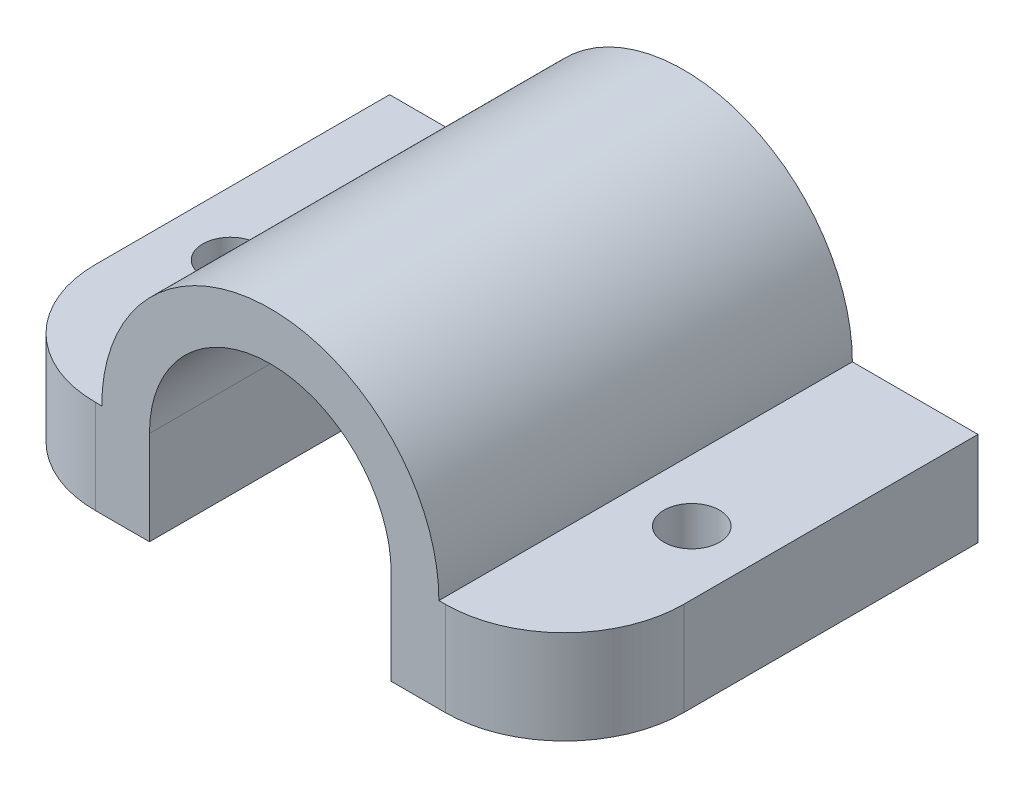
ISO-10303-21;
HEADER;
FILE_DESCRIPTION(('STEP AP214'),'2;1');
FILE_NAME('part.step','',(''),(''),'','','');
FILE_SCHEMA(('AUTOMOTIVE_DESIGN { 1 0 10303 214 1 1 1 1 }'));
ENDSEC;
DATA;
#1=APPLICATION_CONTEXT('core data for automotive mechanical design processes');
#2=APPLICATION_PROTOCOL_DEFINITION('international standard','automotive_design',2000,#1);
#3=PRODUCT_CONTEXT('',#1,'mechanical');
#4=PRODUCT('Part','Part','',(#3));
#5=PRODUCT_RELATED_PRODUCT_CATEGORY('part','',(#4));
#6=PRODUCT_DEFINITION_FORMATION('','',#4);
#7=PRODUCT_DEFINITION_CONTEXT('part definition',#1,'design');
#8=PRODUCT_DEFINITION('design','',#6,#7);
#9=PRODUCT_DEFINITION_SHAPE('','',#8);
#10=(LENGTH_UNIT() NAMED_UNIT(*) SI_UNIT(.MILLI.,.METRE.));
#11=(NAMED_UNIT(*) PLANE_ANGLE_UNIT() SI_UNIT($,.RADIAN.));
#12=(NAMED_UNIT(*) SI_UNIT($,.STERADIAN.) SOLID_ANGLE_UNIT());
#13=UNCERTAINTY_MEASURE_WITH_UNIT(LENGTH_MEASURE(1.E-05),#10,'distance_accuracy_value','');
#14=(GEOMETRIC_REPRESENTATION_CONTEXT(3) GLOBAL_UNCERTAINTY_ASSIGNED_CONTEXT((#13)) GLOBAL_UNIT_ASSIGNED_CONTEXT((#10,
#11,#12)) REPRESENTATION_CONTEXT('',''));
#15=CARTESIAN_POINT('',(0.,0.,0.));
#16=DIRECTION('',(0.,0.,1.));
#17=DIRECTION('',(1.,0.,0.));
#18=AXIS2_PLACEMENT_3D('',#15,#16,#17);
#19=CARTESIAN_POINT('',(0.,0.,12.));
#20=DIRECTION('',(0.,0.,-1.));
#21=DIRECTION('',(-1.,0.,0.));
#22=AXIS2_PLACEMENT_3D('',#19,#20,#21);
#23=CYLINDRICAL_SURFACE('',#22,10.6);
#24=DIRECTION('',(0.,0.,-1.));
#25=VECTOR('',#24,1.);
#26=CARTESIAN_POINT('',(10.6,0.,12.));
#27=LINE('',#26,#25);
#28=CARTESIAN_POINT('',(10.6,0.,12.));
#29=VERTEX_POINT('',#28);
#30=CARTESIAN_POINT('',(10.6,0.,-14.));
#31=VERTEX_POINT('',#30);
#32=EDGE_CURVE('E163',#29,#31,#27,.T.);
#33=ORIENTED_EDGE('',*,*,#32,.T.);
#34=CARTESIAN_POINT('',(0.,0.,-14.));
#35=DIRECTION('',(0.,0.,-1.));
#36=DIRECTION('',(-1.,0.,0.));
#37=AXIS2_PLACEMENT_3D('',#34,#35,#36);
#38=CIRCLE('',#37,10.6);
#39=CARTESIAN_POINT('',(-10.6,0.,-14.));
#40=VERTEX_POINT('',#39);
#41=EDGE_CURVE('E162',#40,#31,#38,.T.);
#42=ORIENTED_EDGE('',*,*,#41,.F.);
#43=DIRECTION('',(0.,0.,-1.));
#44=VECTOR('',#43,1.);
#45=CARTESIAN_POINT('',(-10.6,0.,12.));
#46=LINE('',#45,#44);
#47=CARTESIAN_POINT('',(-10.6,0.,12.));
#48=VERTEX_POINT('',#47);
#49=EDGE_CURVE('E147',#48,#40,#46,.T.);
#50=ORIENTED_EDGE('',*,*,#49,.F.);
#51=CARTESIAN_POINT('',(0.,0.,12.));
#52=DIRECTION('',(0.,0.,1.));
#53=DIRECTION('',(1.,0.,0.));
#54=AXIS2_PLACEMENT_3D('',#51,#52,#53);
#55=CIRCLE('',#54,10.6);
#56=EDGE_CURVE('E221',#48,#29,#55,.F.);
#57=ORIENTED_EDGE('',*,*,#56,.T.);
#58=EDGE_LOOP('',(#33,#42,#50,#57));
#59=FACE_BOUND('',#58,.T.);
#60=ADVANCED_FACE('F35',(#59),#23,.T.);
#61=CARTESIAN_POINT('',(0.,0.,12.));
#62=DIRECTION('',(0.,1.,0.));
#63=DIRECTION('',(0.,0.,1.));
#64=AXIS2_PLACEMENT_3D('',#61,#62,#63);
#65=PLANE('',#64);
#66=CARTESIAN_POINT('',(-14.5,0.,0.));
#67=DIRECTION('',(0.,1.,0.));
#68=DIRECTION('',(0.,0.,1.));
#69=AXIS2_PLACEMENT_3D('',#66,#67,#68);
#70=CIRCLE('',#69,1.75);
#71=CARTESIAN_POINT('',(-14.5,0.,1.75));
#72=VERTEX_POINT('',#71);
#73=EDGE_CURVE('E204',#72,#72,#70,.T.);
#74=ORIENTED_EDGE('',*,*,#73,.F.);
#75=EDGE_LOOP('',(#74));
#76=FACE_BOUND('',#75,.T.);
#77=DIRECTION('',(0.,0.,-1.));
#78=VECTOR('',#77,1.);
#79=CARTESIAN_POINT('',(-18.5,0.,12.));
#80=LINE('',#79,#78);
#81=CARTESIAN_POINT('',(-18.5,0.,4.5));
#82=VERTEX_POINT('',#81);
#83=CARTESIAN_POINT('',(-18.5,0.,-14.));
#84=VERTEX_POINT('',#83);
#85=EDGE_CURVE('E159',#82,#84,#80,.T.);
#86=ORIENTED_EDGE('',*,*,#85,.F.);
#87=CARTESIAN_POINT('',(-11.,0.,4.5));
#88=DIRECTION('',(0.,1.,0.));
#89=DIRECTION('',(0.,0.,1.));
#90=AXIS2_PLACEMENT_3D('',#87,#88,#89);
#91=CIRCLE('',#90,7.5);
#92=CARTESIAN_POINT('',(-11.,0.,12.));
#93=VERTEX_POINT('',#92);
#94=EDGE_CURVE('E43',#82,#93,#91,.T.);
#95=ORIENTED_EDGE('',*,*,#94,.T.);
#96=DIRECTION('',(1.,0.,0.));
#97=VECTOR('',#96,1.);
#98=CARTESIAN_POINT('',(0.,0.,12.));
#99=LINE('',#98,#97);
#100=EDGE_CURVE('E154',#93,#48,#99,.T.);
#101=ORIENTED_EDGE('',*,*,#100,.T.);
#102=ORIENTED_EDGE('',*,*,#49,.T.);
#103=DIRECTION('',(1.,0.,0.));
#104=VECTOR('',#103,1.);
#105=CARTESIAN_POINT('',(0.,0.,-14.));
#106=LINE('',#105,#104);
#107=EDGE_CURVE('E152',#84,#40,#106,.T.);
#108=ORIENTED_EDGE('',*,*,#107,.F.);
#109=EDGE_LOOP('',(#86,#95,#101,#102,#108));
#110=FACE_BOUND('',#109,.T.);
#111=ADVANCED_FACE('F150',(#76,#110),#65,.T.);
#112=CARTESIAN_POINT('',(-18.5,0.,12.));
#113=DIRECTION('',(-1.,0.,0.));
#114=DIRECTION('',(0.,0.,1.));
#115=AXIS2_PLACEMENT_3D('',#112,#113,#114);
#116=PLANE('',#115);
#117=DIRECTION('',(0.,0.,-1.));
#118=VECTOR('',#117,1.);
#119=CARTESIAN_POINT('',(-18.5,-5.9,12.));
#120=LINE('',#119,#118);
#121=CARTESIAN_POINT('',(-18.5,-5.9,4.5));
#122=VERTEX_POINT('',#121);
#123=CARTESIAN_POINT('',(-18.5,-5.9,-14.));
#124=VERTEX_POINT('',#123);
#125=EDGE_CURVE('E261',#122,#124,#120,.T.);
#126=ORIENTED_EDGE('',*,*,#125,.F.);
#127=DIRECTION('',(0.,1.,0.));
#128=VECTOR('',#127,1.);
#129=CARTESIAN_POINT('',(-18.5,0.,4.5));
#130=LINE('',#129,#128);
#131=EDGE_CURVE('E274',#122,#82,#130,.T.);
#132=ORIENTED_EDGE('',*,*,#131,.T.);
#133=ORIENTED_EDGE('',*,*,#85,.T.);
#134=DIRECTION('',(0.,1.,0.));
#135=VECTOR('',#134,1.);
#136=CARTESIAN_POINT('',(-18.5,0.,-14.));
#137=LINE('',#136,#135);
#138=EDGE_CURVE('E173',#124,#84,#137,.T.);
#139=ORIENTED_EDGE('',*,*,#138,.F.);
#140=EDGE_LOOP('',(#126,#132,#133,#139));
#141=FACE_BOUND('',#140,.T.);
#142=ADVANCED_FACE('F280',(#141),#116,.T.);
#143=CARTESIAN_POINT('',(0.,-5.9,12.));
#144=DIRECTION('',(0.,-1.,0.));
#145=DIRECTION('',(1.,0.,0.));
#146=AXIS2_PLACEMENT_3D('',#143,#144,#145);
#147=PLANE('',#146);
#148=CARTESIAN_POINT('',(-14.5,-5.9,0.));
#149=DIRECTION('',(0.,-1.,0.));
#150=DIRECTION('',(1.,0.,0.));
#151=AXIS2_PLACEMENT_3D('',#148,#149,#150);
#152=CIRCLE('',#151,1.75);
#153=CARTESIAN_POINT('',(-12.75,-5.9,0.));
#154=VERTEX_POINT('',#153);
#155=EDGE_CURVE('E556',#154,#154,#152,.F.);
#156=ORIENTED_EDGE('',*,*,#155,.T.);
#157=EDGE_LOOP('',(#156));
#158=FACE_BOUND('',#157,.T.);
#159=DIRECTION('',(-1.,0.,0.));
#160=VECTOR('',#159,1.);
#161=CARTESIAN_POINT('',(0.,-5.9,12.));
#162=LINE('',#161,#160);
#163=CARTESIAN_POINT('',(-7.6,-5.9,12.));
#164=VERTEX_POINT('',#163);
#165=CARTESIAN_POINT('',(-11.,-5.9,12.));
#166=VERTEX_POINT('',#165);
#167=EDGE_CURVE('E225',#164,#166,#162,.T.);
#168=ORIENTED_EDGE('',*,*,#167,.T.);
#169=CARTESIAN_POINT('',(-11.,-5.9,4.5));
#170=DIRECTION('',(0.,-1.,0.));
#171=DIRECTION('',(1.,0.,0.));
#172=AXIS2_PLACEMENT_3D('',#169,#170,#171);
#173=CIRCLE('',#172,7.5);
#174=EDGE_CURVE('E11',#166,#122,#173,.T.);
#175=ORIENTED_EDGE('',*,*,#174,.T.);
#176=ORIENTED_EDGE('',*,*,#125,.T.);
#177=DIRECTION('',(-1.,0.,0.));
#178=VECTOR('',#177,1.);
#179=CARTESIAN_POINT('',(0.,-5.9,-14.));
#180=LINE('',#179,#178);
#181=CARTESIAN_POINT('',(-4.6,-5.9,-14.));
#182=VERTEX_POINT('',#181);
#183=EDGE_CURVE('E197',#182,#124,#180,.T.);
#184=ORIENTED_EDGE('',*,*,#183,.F.);
#185=DIRECTION('',(0.,0.,1.));
#186=VECTOR('',#185,1.);
#187=CARTESIAN_POINT('',(-4.6,-5.9,-14.));
#188=LINE('',#187,#186);
#189=CARTESIAN_POINT('',(-4.6,-5.9,-12.));
#190=VERTEX_POINT('',#189);
#191=EDGE_CURVE('E200',#182,#190,#188,.T.);
#192=ORIENTED_EDGE('',*,*,#191,.T.);
#193=DIRECTION('',(-1.,0.,0.));
#194=VECTOR('',#193,1.);
#195=CARTESIAN_POINT('',(0.,-5.9,-12.));
#196=LINE('',#195,#194);
#197=CARTESIAN_POINT('',(-7.6,-5.9,-12.));
#198=VERTEX_POINT('',#197);
#199=EDGE_CURVE('E174',#190,#198,#196,.T.);
#200=ORIENTED_EDGE('',*,*,#199,.T.);
#201=DIRECTION('',(0.,0.,-1.));
#202=VECTOR('',#201,1.);
#203=CARTESIAN_POINT('',(-7.6,-5.9,12.));
#204=LINE('',#203,#202);
#205=EDGE_CURVE('E259',#164,#198,#204,.T.);
#206=ORIENTED_EDGE('',*,*,#205,.F.);
#207=EDGE_LOOP('',(#168,#175,#176,#184,#192,#200,#206));
#208=FACE_BOUND('',#207,.T.);
#209=ADVANCED_FACE('F282',(#158,#208),#147,.T.);
#210=CARTESIAN_POINT('',(-7.6,0.,12.));
#211=DIRECTION('',(1.,0.,0.));
#212=DIRECTION('',(0.,1.,0.));
#213=AXIS2_PLACEMENT_3D('',#210,#211,#212);
#214=PLANE('',#213);
#215=DIRECTION('',(0.,-1.,0.));
#216=VECTOR('',#215,1.);
#217=CARTESIAN_POINT('',(-7.6,0.,-12.));
#218=LINE('',#217,#216);
#219=CARTESIAN_POINT('',(-7.6,0.,-12.));
#220=VERTEX_POINT('',#219);
#221=EDGE_CURVE('E220',#220,#198,#218,.T.);
#222=ORIENTED_EDGE('',*,*,#221,.F.);
#223=DIRECTION('',(0.,0.,-1.));
#224=VECTOR('',#223,1.);
#225=CARTESIAN_POINT('',(-7.6,0.,12.));
#226=LINE('',#225,#224);
#227=CARTESIAN_POINT('',(-7.6,0.,12.));
#228=VERTEX_POINT('',#227);
#229=EDGE_CURVE('E257',#228,#220,#226,.T.);
#230=ORIENTED_EDGE('',*,*,#229,.F.);
#231=DIRECTION('',(0.,-1.,0.));
#232=VECTOR('',#231,1.);
#233=CARTESIAN_POINT('',(-7.6,0.,12.));
#234=LINE('',#233,#232);
#235=EDGE_CURVE('E227',#228,#164,#234,.T.);
#236=ORIENTED_EDGE('',*,*,#235,.T.);
#237=ORIENTED_EDGE('',*,*,#205,.T.);
#238=EDGE_LOOP('',(#222,#230,#236,#237));
#239=FACE_BOUND('',#238,.T.);
#240=ADVANCED_FACE('F298',(#239),#214,.T.);
#241=CARTESIAN_POINT('',(0.,0.,12.));
#242=DIRECTION('',(0.,0.,-1.));
#243=DIRECTION('',(-1.,0.,0.));
#244=AXIS2_PLACEMENT_3D('',#241,#242,#243);
#245=CYLINDRICAL_SURFACE('',#244,7.6);
#246=CARTESIAN_POINT('',(0.,0.,-12.));
#247=DIRECTION('',(0.,0.,1.));
#248=DIRECTION('',(1.,0.,0.));
#249=AXIS2_PLACEMENT_3D('',#246,#247,#248);
#250=CIRCLE('',#249,7.6);
#251=CARTESIAN_POINT('',(7.6,0.,-12.));
#252=VERTEX_POINT('',#251);
#253=EDGE_CURVE('E243',#252,#220,#250,.T.);
#254=ORIENTED_EDGE('',*,*,#253,.F.);
#255=DIRECTION('',(0.,0.,-1.));
#256=VECTOR('',#255,1.);
#257=CARTESIAN_POINT('',(7.6,0.,12.));
#258=LINE('',#257,#256);
#259=CARTESIAN_POINT('',(7.6,0.,12.));
#260=VERTEX_POINT('',#259);
#261=EDGE_CURVE('E255',#260,#252,#258,.T.);
#262=ORIENTED_EDGE('',*,*,#261,.F.);
#263=CARTESIAN_POINT('',(0.,0.,12.));
#264=DIRECTION('',(0.,0.,1.));
#265=DIRECTION('',(1.,0.,0.));
#266=AXIS2_PLACEMENT_3D('',#263,#264,#265);
#267=CIRCLE('',#266,7.6);
#268=EDGE_CURVE('E230',#260,#228,#267,.T.);
#269=ORIENTED_EDGE('',*,*,#268,.T.);
#270=ORIENTED_EDGE('',*,*,#229,.T.);
#271=EDGE_LOOP('',(#254,#262,#269,#270));
#272=FACE_BOUND('',#271,.T.);
#273=ADVANCED_FACE('F302',(#272),#245,.F.);
#274=CARTESIAN_POINT('',(7.6,0.,12.));
#275=DIRECTION('',(1.,0.,0.));
#276=DIRECTION('',(0.,1.,0.));
#277=AXIS2_PLACEMENT_3D('',#274,#275,#276);
#278=PLANE('',#277);
#279=DIRECTION('',(0.,-1.,0.));
#280=VECTOR('',#279,1.);
#281=CARTESIAN_POINT('',(7.6,0.,-12.));
#282=LINE('',#281,#280);
#283=CARTESIAN_POINT('',(7.6,-5.9,-12.));
#284=VERTEX_POINT('',#283);
#285=EDGE_CURVE('E223',#252,#284,#282,.T.);
#286=ORIENTED_EDGE('',*,*,#285,.T.);
#287=DIRECTION('',(0.,0.,-1.));
#288=VECTOR('',#287,1.);
#289=CARTESIAN_POINT('',(7.6,-5.9,12.));
#290=LINE('',#289,#288);
#291=CARTESIAN_POINT('',(7.6,-5.9,12.));
#292=VERTEX_POINT('',#291);
#293=EDGE_CURVE('E252',#292,#284,#290,.T.);
#294=ORIENTED_EDGE('',*,*,#293,.F.);
#295=DIRECTION('',(0.,-1.,0.));
#296=VECTOR('',#295,1.);
#297=CARTESIAN_POINT('',(7.6,0.,12.));
#298=LINE('',#297,#296);
#299=EDGE_CURVE('E233',#260,#292,#298,.T.);
#300=ORIENTED_EDGE('',*,*,#299,.F.);
#301=ORIENTED_EDGE('',*,*,#261,.T.);
#302=EDGE_LOOP('',(#286,#294,#300,#301));
#303=FACE_BOUND('',#302,.T.);
#304=ADVANCED_FACE('F306',(#303),#278,.F.);
#305=CARTESIAN_POINT('',(0.,-5.9,12.));
#306=DIRECTION('',(0.,1.,0.));
#307=DIRECTION('',(-1.,0.,0.));
#308=AXIS2_PLACEMENT_3D('',#305,#306,#307);
#309=PLANE('',#308);
#310=CARTESIAN_POINT('',(14.5,-5.9,0.));
#311=DIRECTION('',(0.,1.,0.));
#312=DIRECTION('',(-1.,0.,0.));
#313=AXIS2_PLACEMENT_3D('',#310,#311,#312);
#314=CIRCLE('',#313,1.75);
#315=CARTESIAN_POINT('',(12.75,-5.9,0.));
#316=VERTEX_POINT('',#315);
#317=EDGE_CURVE('E180',#316,#316,#314,.F.);
#318=ORIENTED_EDGE('',*,*,#317,.F.);
#319=EDGE_LOOP('',(#318));
#320=FACE_BOUND('',#319,.T.);
#321=DIRECTION('',(0.,0.,-1.));
#322=VECTOR('',#321,1.);
#323=CARTESIAN_POINT('',(18.5,-5.9,12.));
#324=LINE('',#323,#322);
#325=CARTESIAN_POINT('',(18.5,-5.9,4.5));
#326=VERTEX_POINT('',#325);
#327=CARTESIAN_POINT('',(18.5,-5.9,-14.));
#328=VERTEX_POINT('',#327);
#329=EDGE_CURVE('E250',#326,#328,#324,.T.);
#330=ORIENTED_EDGE('',*,*,#329,.F.);
#331=CARTESIAN_POINT('',(11.,-5.9,4.5));
#332=DIRECTION('',(0.,1.,0.));
#333=DIRECTION('',(-1.,0.,0.));
#334=AXIS2_PLACEMENT_3D('',#331,#332,#333);
#335=CIRCLE('',#334,7.5);
#336=CARTESIAN_POINT('',(11.,-5.9,12.));
#337=VERTEX_POINT('',#336);
#338=EDGE_CURVE('E266',#326,#337,#335,.F.);
#339=ORIENTED_EDGE('',*,*,#338,.T.);
#340=DIRECTION('',(1.,0.,0.));
#341=VECTOR('',#340,1.);
#342=CARTESIAN_POINT('',(0.,-5.9,12.));
#343=LINE('',#342,#341);
#344=EDGE_CURVE('E235',#292,#337,#343,.T.);
#345=ORIENTED_EDGE('',*,*,#344,.F.);
#346=ORIENTED_EDGE('',*,*,#293,.T.);
#347=DIRECTION('',(-1.,0.,0.));
#348=VECTOR('',#347,1.);
#349=CARTESIAN_POINT('',(0.,-5.9,-12.));
#350=LINE('',#349,#348);
#351=CARTESIAN_POINT('',(4.6,-5.9,-12.));
#352=VERTEX_POINT('',#351);
#353=EDGE_CURVE('E201',#284,#352,#350,.T.);
#354=ORIENTED_EDGE('',*,*,#353,.T.);
#355=DIRECTION('',(0.,0.,1.));
#356=VECTOR('',#355,1.);
#357=CARTESIAN_POINT('',(4.6,-5.9,-14.));
#358=LINE('',#357,#356);
#359=CARTESIAN_POINT('',(4.6,-5.9,-14.));
#360=VERTEX_POINT('',#359);
#361=EDGE_CURVE('E217',#360,#352,#358,.T.);
#362=ORIENTED_EDGE('',*,*,#361,.F.);
#363=DIRECTION('',(-1.,0.,0.));
#364=VECTOR('',#363,1.);
#365=CARTESIAN_POINT('',(0.,-5.9,-14.));
#366=LINE('',#365,#364);
#367=EDGE_CURVE('E187',#328,#360,#366,.T.);
#368=ORIENTED_EDGE('',*,*,#367,.F.);
#369=EDGE_LOOP('',(#330,#339,#345,#346,#354,#362,#368));
#370=FACE_BOUND('',#369,.T.);
#371=ADVANCED_FACE('F323',(#320,#370),#309,.F.);
#372=CARTESIAN_POINT('',(18.5,0.,12.));
#373=DIRECTION('',(1.,0.,0.));
#374=DIRECTION('',(0.,0.,-1.));
#375=AXIS2_PLACEMENT_3D('',#372,#373,#374);
#376=PLANE('',#375);
#377=DIRECTION('',(0.,0.,-1.));
#378=VECTOR('',#377,1.);
#379=CARTESIAN_POINT('',(18.5,0.,12.));
#380=LINE('',#379,#378);
#381=CARTESIAN_POINT('',(18.5,0.,4.5));
#382=VERTEX_POINT('',#381);
#383=CARTESIAN_POINT('',(18.5,0.,-14.));
#384=VERTEX_POINT('',#383);
#385=EDGE_CURVE('E248',#382,#384,#380,.T.);
#386=ORIENTED_EDGE('',*,*,#385,.F.);
#387=DIRECTION('',(0.,-1.,0.));
#388=VECTOR('',#387,1.);
#389=CARTESIAN_POINT('',(18.5,0.,4.5));
#390=LINE('',#389,#388);
#391=EDGE_CURVE('E158',#382,#326,#390,.T.);
#392=ORIENTED_EDGE('',*,*,#391,.T.);
#393=ORIENTED_EDGE('',*,*,#329,.T.);
#394=DIRECTION('',(0.,-1.,0.));
#395=VECTOR('',#394,1.);
#396=CARTESIAN_POINT('',(18.5,0.,-14.));
#397=LINE('',#396,#395);
#398=EDGE_CURVE('E184',#384,#328,#397,.T.);
#399=ORIENTED_EDGE('',*,*,#398,.F.);
#400=EDGE_LOOP('',(#386,#392,#393,#399));
#401=FACE_BOUND('',#400,.T.);
#402=ADVANCED_FACE('F319',(#401),#376,.T.);
#403=CARTESIAN_POINT('',(0.,0.,12.));
#404=DIRECTION('',(0.,1.,0.));
#405=DIRECTION('',(-1.,0.,0.));
#406=AXIS2_PLACEMENT_3D('',#403,#404,#405);
#407=PLANE('',#406);
#408=CARTESIAN_POINT('',(14.5,0.,0.));
#409=DIRECTION('',(0.,1.,0.));
#410=DIRECTION('',(0.,0.,1.));
#411=AXIS2_PLACEMENT_3D('',#408,#409,#410);
#412=CIRCLE('',#411,1.75);
#413=CARTESIAN_POINT('',(14.5,0.,1.75));
#414=VERTEX_POINT('',#413);
#415=EDGE_CURVE('E554',#414,#414,#412,.T.);
#416=ORIENTED_EDGE('',*,*,#415,.F.);
#417=EDGE_LOOP('',(#416));
#418=FACE_BOUND('',#417,.T.);
#419=DIRECTION('',(1.,0.,0.));
#420=VECTOR('',#419,1.);
#421=CARTESIAN_POINT('',(0.,0.,12.));
#422=LINE('',#421,#420);
#423=CARTESIAN_POINT('',(11.,0.,12.));
#424=VERTEX_POINT('',#423);
#425=EDGE_CURVE('E238',#29,#424,#422,.T.);
#426=ORIENTED_EDGE('',*,*,#425,.T.);
#427=CARTESIAN_POINT('',(11.,0.,4.5));
#428=DIRECTION('',(0.,1.,0.));
#429=DIRECTION('',(-1.,0.,0.));
#430=AXIS2_PLACEMENT_3D('',#427,#428,#429);
#431=CIRCLE('',#430,7.5);
#432=EDGE_CURVE('E272',#424,#382,#431,.T.);
#433=ORIENTED_EDGE('',*,*,#432,.T.);
#434=ORIENTED_EDGE('',*,*,#385,.T.);
#435=DIRECTION('',(1.,0.,0.));
#436=VECTOR('',#435,1.);
#437=CARTESIAN_POINT('',(0.,0.,-14.));
#438=LINE('',#437,#436);
#439=EDGE_CURVE('E167',#31,#384,#438,.T.);
#440=ORIENTED_EDGE('',*,*,#439,.F.);
#441=ORIENTED_EDGE('',*,*,#32,.F.);
#442=EDGE_LOOP('',(#426,#433,#434,#440,#441));
#443=FACE_BOUND('',#442,.T.);
#444=ADVANCED_FACE('F316',(#418,#443),#407,.T.);
#445=CARTESIAN_POINT('',(0.,0.,12.));
#446=DIRECTION('',(0.,0.,1.));
#447=DIRECTION('',(1.,0.,0.));
#448=AXIS2_PLACEMENT_3D('',#445,#446,#447);
#449=PLANE('',#448);
#450=ORIENTED_EDGE('',*,*,#344,.T.);
#451=DIRECTION('',(0.,-1.,0.));
#452=VECTOR('',#451,1.);
#453=CARTESIAN_POINT('',(11.,0.,12.));
#454=LINE('',#453,#452);
#455=EDGE_CURVE('E270',#337,#424,#454,.F.);
#456=ORIENTED_EDGE('',*,*,#455,.T.);
#457=ORIENTED_EDGE('',*,*,#425,.F.);
#458=ORIENTED_EDGE('',*,*,#56,.F.);
#459=ORIENTED_EDGE('',*,*,#100,.F.);
#460=DIRECTION('',(0.,1.,0.));
#461=VECTOR('',#460,1.);
#462=CARTESIAN_POINT('',(-11.,0.,12.));
#463=LINE('',#462,#461);
#464=EDGE_CURVE('E268',#93,#166,#463,.F.);
#465=ORIENTED_EDGE('',*,*,#464,.T.);
#466=ORIENTED_EDGE('',*,*,#167,.F.);
#467=ORIENTED_EDGE('',*,*,#235,.F.);
#468=ORIENTED_EDGE('',*,*,#268,.F.);
#469=ORIENTED_EDGE('',*,*,#299,.T.);
#470=EDGE_LOOP('',(#450,#456,#457,#458,#459,#465,#466,#467,#468,#469));
#471=FACE_BOUND('',#470,.T.);
#472=ADVANCED_FACE('F276',(#471),#449,.T.);
#473=CARTESIAN_POINT('',(4.6,0.,-14.));
#474=DIRECTION('',(-1.,0.,0.));
#475=DIRECTION('',(0.,0.,1.));
#476=AXIS2_PLACEMENT_3D('',#473,#474,#475);
#477=PLANE('',#476);
#478=DIRECTION('',(0.,-1.,0.));
#479=VECTOR('',#478,1.);
#480=CARTESIAN_POINT('',(4.6,0.,-12.));
#481=LINE('',#480,#479);
#482=CARTESIAN_POINT('',(4.6,0.,-12.));
#483=VERTEX_POINT('',#482);
#484=EDGE_CURVE('E203',#483,#352,#481,.T.);
#485=ORIENTED_EDGE('',*,*,#484,.F.);
#486=DIRECTION('',(0.,0.,1.));
#487=VECTOR('',#486,1.);
#488=CARTESIAN_POINT('',(4.6,0.,-14.));
#489=LINE('',#488,#487);
#490=CARTESIAN_POINT('',(4.6,0.,-14.));
#491=VERTEX_POINT('',#490);
#492=EDGE_CURVE('E215',#491,#483,#489,.T.);
#493=ORIENTED_EDGE('',*,*,#492,.F.);
#494=DIRECTION('',(0.,-1.,0.));
#495=VECTOR('',#494,1.);
#496=CARTESIAN_POINT('',(4.6,0.,-14.));
#497=LINE('',#496,#495);
#498=EDGE_CURVE('E189',#491,#360,#497,.T.);
#499=ORIENTED_EDGE('',*,*,#498,.T.);
#500=ORIENTED_EDGE('',*,*,#361,.T.);
#501=EDGE_LOOP('',(#485,#493,#499,#500));
#502=FACE_BOUND('',#501,.T.);
#503=ADVANCED_FACE('F327',(#502),#477,.T.);
#504=CARTESIAN_POINT('',(0.,0.,-14.));
#505=DIRECTION('',(0.,0.,1.));
#506=DIRECTION('',(1.,0.,0.));
#507=AXIS2_PLACEMENT_3D('',#504,#505,#506);
#508=CYLINDRICAL_SURFACE('',#507,4.6);
#509=CARTESIAN_POINT('',(0.,0.,-12.));
#510=DIRECTION('',(0.,0.,-1.));
#511=DIRECTION('',(-1.,0.,0.));
#512=AXIS2_PLACEMENT_3D('',#509,#510,#511);
#513=CIRCLE('',#512,4.6);
#514=CARTESIAN_POINT('',(-4.6,0.,-12.));
#515=VERTEX_POINT('',#514);
#516=EDGE_CURVE('E207',#515,#483,#513,.T.);
#517=ORIENTED_EDGE('',*,*,#516,.F.);
#518=DIRECTION('',(0.,0.,1.));
#519=VECTOR('',#518,1.);
#520=CARTESIAN_POINT('',(-4.6,0.,-14.));
#521=LINE('',#520,#519);
#522=CARTESIAN_POINT('',(-4.6,0.,-14.));
#523=VERTEX_POINT('',#522);
#524=EDGE_CURVE('E213',#523,#515,#521,.T.);
#525=ORIENTED_EDGE('',*,*,#524,.F.);
#526=CARTESIAN_POINT('',(0.,0.,-14.));
#527=DIRECTION('',(0.,0.,-1.));
#528=DIRECTION('',(-1.,0.,0.));
#529=AXIS2_PLACEMENT_3D('',#526,#527,#528);
#530=CIRCLE('',#529,4.6);
#531=EDGE_CURVE('E192',#523,#491,#530,.T.);
#532=ORIENTED_EDGE('',*,*,#531,.T.);
#533=ORIENTED_EDGE('',*,*,#492,.T.);
#534=EDGE_LOOP('',(#517,#525,#532,#533));
#535=FACE_BOUND('',#534,.T.);
#536=ADVANCED_FACE('F329',(#535),#508,.F.);
#537=CARTESIAN_POINT('',(-4.6,0.,-14.));
#538=DIRECTION('',(-1.,0.,0.));
#539=DIRECTION('',(0.,0.,1.));
#540=AXIS2_PLACEMENT_3D('',#537,#538,#539);
#541=PLANE('',#540);
#542=DIRECTION('',(0.,-1.,0.));
#543=VECTOR('',#542,1.);
#544=CARTESIAN_POINT('',(-4.6,0.,-12.));
#545=LINE('',#544,#543);
#546=EDGE_CURVE('E177',#515,#190,#545,.T.);
#547=ORIENTED_EDGE('',*,*,#546,.T.);
#548=ORIENTED_EDGE('',*,*,#191,.F.);
#549=DIRECTION('',(0.,-1.,0.));
#550=VECTOR('',#549,1.);
#551=CARTESIAN_POINT('',(-4.6,0.,-14.));
#552=LINE('',#551,#550);
#553=EDGE_CURVE('E195',#523,#182,#552,.T.);
#554=ORIENTED_EDGE('',*,*,#553,.F.);
#555=ORIENTED_EDGE('',*,*,#524,.T.);
#556=EDGE_LOOP('',(#547,#548,#554,#555));
#557=FACE_BOUND('',#556,.T.);
#558=ADVANCED_FACE('F288',(#557),#541,.F.);
#559=CARTESIAN_POINT('',(0.,0.,-14.));
#560=DIRECTION('',(0.,0.,-1.));
#561=DIRECTION('',(-1.,0.,0.));
#562=AXIS2_PLACEMENT_3D('',#559,#560,#561);
#563=PLANE('',#562);
#564=ORIENTED_EDGE('',*,*,#107,.T.);
#565=ORIENTED_EDGE('',*,*,#41,.T.);
#566=ORIENTED_EDGE('',*,*,#439,.T.);
#567=ORIENTED_EDGE('',*,*,#398,.T.);
#568=ORIENTED_EDGE('',*,*,#367,.T.);
#569=ORIENTED_EDGE('',*,*,#498,.F.);
#570=ORIENTED_EDGE('',*,*,#531,.F.);
#571=ORIENTED_EDGE('',*,*,#553,.T.);
#572=ORIENTED_EDGE('',*,*,#183,.T.);
#573=ORIENTED_EDGE('',*,*,#138,.T.);
#574=EDGE_LOOP('',(#564,#565,#566,#567,#568,#569,#570,#571,#572,#573));
#575=FACE_BOUND('',#574,.T.);
#576=ADVANCED_FACE('F170',(#575),#563,.T.);
#577=CARTESIAN_POINT('',(0.,0.,-12.));
#578=DIRECTION('',(0.,0.,-1.));
#579=DIRECTION('',(-1.,0.,0.));
#580=AXIS2_PLACEMENT_3D('',#577,#578,#579);
#581=PLANE('',#580);
#582=ORIENTED_EDGE('',*,*,#285,.F.);
#583=ORIENTED_EDGE('',*,*,#253,.T.);
#584=ORIENTED_EDGE('',*,*,#221,.T.);
#585=ORIENTED_EDGE('',*,*,#199,.F.);
#586=ORIENTED_EDGE('',*,*,#546,.F.);
#587=ORIENTED_EDGE('',*,*,#516,.T.);
#588=ORIENTED_EDGE('',*,*,#484,.T.);
#589=ORIENTED_EDGE('',*,*,#353,.F.);
#590=EDGE_LOOP('',(#582,#583,#584,#585,#586,#587,#588,#589));
#591=FACE_BOUND('',#590,.T.);
#592=ADVANCED_FACE('F293',(#591),#581,.F.);
#593=CARTESIAN_POINT('',(14.5,-5.901,0.));
#594=DIRECTION('',(0.,1.,0.));
#595=DIRECTION('',(0.,0.,1.));
#596=AXIS2_PLACEMENT_3D('',#593,#594,#595);
#597=CYLINDRICAL_SURFACE('',#596,1.75);
#598=ORIENTED_EDGE('',*,*,#415,.T.);
#599=EDGE_LOOP('',(#598));
#600=FACE_BOUND('',#599,.T.);
#601=ORIENTED_EDGE('',*,*,#317,.T.);
#602=EDGE_LOOP('',(#601));
#603=FACE_BOUND('',#602,.T.);
#604=ADVANCED_FACE('F352',(#600,#603),#597,.F.);
#605=CARTESIAN_POINT('',(-14.5,-5.901,0.));
#606=DIRECTION('',(0.,1.,0.));
#607=DIRECTION('',(0.,0.,1.));
#608=AXIS2_PLACEMENT_3D('',#605,#606,#607);
#609=CYLINDRICAL_SURFACE('',#608,1.75);
#610=ORIENTED_EDGE('',*,*,#155,.F.);
#611=EDGE_LOOP('',(#610));
#612=FACE_BOUND('',#611,.T.);
#613=ORIENTED_EDGE('',*,*,#73,.T.);
#614=EDGE_LOOP('',(#613));
#615=FACE_BOUND('',#614,.T.);
#616=ADVANCED_FACE('F347',(#612,#615),#609,.F.);
#617=CARTESIAN_POINT('',(11.,0.,4.5));
#618=DIRECTION('',(0.,-1.,0.));
#619=DIRECTION('',(0.,0.,-1.));
#620=AXIS2_PLACEMENT_3D('',#617,#618,#619);
#621=CYLINDRICAL_SURFACE('',#620,7.5);
#622=ORIENTED_EDGE('',*,*,#432,.F.);
#623=ORIENTED_EDGE('',*,*,#455,.F.);
#624=ORIENTED_EDGE('',*,*,#338,.F.);
#625=ORIENTED_EDGE('',*,*,#391,.F.);
#626=EDGE_LOOP('',(#622,#623,#624,#625));
#627=FACE_BOUND('',#626,.T.);
#628=ADVANCED_FACE('F312',(#627),#621,.T.);
#629=CARTESIAN_POINT('',(-11.,0.,4.5));
#630=DIRECTION('',(0.,1.,0.));
#631=DIRECTION('',(0.,0.,1.));
#632=AXIS2_PLACEMENT_3D('',#629,#630,#631);
#633=CYLINDRICAL_SURFACE('',#632,7.5);
#634=ORIENTED_EDGE('',*,*,#174,.F.);
#635=ORIENTED_EDGE('',*,*,#464,.F.);
#636=ORIENTED_EDGE('',*,*,#94,.F.);
#637=ORIENTED_EDGE('',*,*,#131,.F.);
#638=EDGE_LOOP('',(#634,#635,#636,#637));
#639=FACE_BOUND('',#638,.T.);
#640=ADVANCED_FACE('F37',(#639),#633,.T.);
#641=CLOSED_SHELL('',(#60,#111,#142,#209,#240,#273,#304,#371,#402,#444,#472,#503,#536,#558,#576,
#592,#604,#616,#628,#640));
#642=MANIFOLD_SOLID_BREP('B2',#641);
#643=ADVANCED_BREP_SHAPE_REPRESENTATION('',(#18,#642),#14);
#644=SHAPE_DEFINITION_REPRESENTATION(#9,#643);
ENDSEC;
END-ISO-10303-21;
